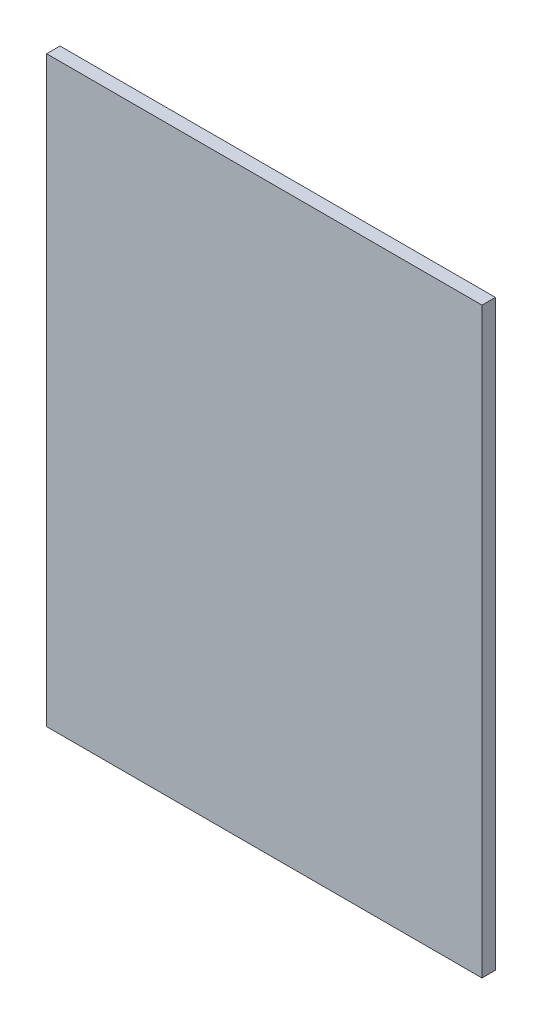
ISO-10303-21;
HEADER;
FILE_DESCRIPTION(('STEP AP214'),'2;1');
FILE_NAME('part.step','',(''),(''),'','','');
FILE_SCHEMA(('AUTOMOTIVE_DESIGN { 1 0 10303 214 1 1 1 1 }'));
ENDSEC;
DATA;
#1=APPLICATION_CONTEXT('core data for automotive mechanical design processes');
#2=APPLICATION_PROTOCOL_DEFINITION('international standard','automotive_design',2000,#1);
#3=PRODUCT_CONTEXT('',#1,'mechanical');
#4=PRODUCT('Part','Part','',(#3));
#5=PRODUCT_RELATED_PRODUCT_CATEGORY('part','',(#4));
#6=PRODUCT_DEFINITION_FORMATION('','',#4);
#7=PRODUCT_DEFINITION_CONTEXT('part definition',#1,'design');
#8=PRODUCT_DEFINITION('design','',#6,#7);
#9=PRODUCT_DEFINITION_SHAPE('','',#8);
#10=(LENGTH_UNIT() NAMED_UNIT(*) SI_UNIT(.MILLI.,.METRE.));
#11=(NAMED_UNIT(*) PLANE_ANGLE_UNIT() SI_UNIT($,.RADIAN.));
#12=(NAMED_UNIT(*) SI_UNIT($,.STERADIAN.) SOLID_ANGLE_UNIT());
#13=UNCERTAINTY_MEASURE_WITH_UNIT(LENGTH_MEASURE(1.E-05),#10,'distance_accuracy_value','');
#14=(GEOMETRIC_REPRESENTATION_CONTEXT(3) GLOBAL_UNCERTAINTY_ASSIGNED_CONTEXT((#13)) GLOBAL_UNIT_ASSIGNED_CONTEXT((#10,
#11,#12)) REPRESENTATION_CONTEXT('',''));
#15=CARTESIAN_POINT('',(0.,0.,0.));
#16=DIRECTION('',(0.,0.,1.));
#17=DIRECTION('',(1.,0.,0.));
#18=AXIS2_PLACEMENT_3D('',#15,#16,#17);
#19=CARTESIAN_POINT('',(32.5,43.5,2.));
#20=DIRECTION('',(-1.,0.,0.));
#21=DIRECTION('',(0.,-1.,0.));
#22=AXIS2_PLACEMENT_3D('',#19,#20,#21);
#23=PLANE('',#22);
#24=DIRECTION('',(0.,1.,0.));
#25=VECTOR('',#24,1.);
#26=CARTESIAN_POINT('',(32.5,43.5,0.));
#27=LINE('',#26,#25);
#28=CARTESIAN_POINT('',(32.5,-43.5,0.));
#29=VERTEX_POINT('',#28);
#30=CARTESIAN_POINT('',(32.5,43.5,0.));
#31=VERTEX_POINT('',#30);
#32=EDGE_CURVE('E113',#29,#31,#27,.T.);
#33=ORIENTED_EDGE('',*,*,#32,.T.);
#34=DIRECTION('',(0.,0.,-1.));
#35=VECTOR('',#34,1.);
#36=CARTESIAN_POINT('',(32.5,43.5,2.));
#37=LINE('',#36,#35);
#38=CARTESIAN_POINT('',(32.5,43.5,2.));
#39=VERTEX_POINT('',#38);
#40=EDGE_CURVE('E11',#39,#31,#37,.T.);
#41=ORIENTED_EDGE('',*,*,#40,.F.);
#42=DIRECTION('',(0.,1.,0.));
#43=VECTOR('',#42,1.);
#44=CARTESIAN_POINT('',(32.5,43.5,2.));
#45=LINE('',#44,#43);
#46=CARTESIAN_POINT('',(32.5,-43.5,2.));
#47=VERTEX_POINT('',#46);
#48=EDGE_CURVE('E97',#47,#39,#45,.T.);
#49=ORIENTED_EDGE('',*,*,#48,.F.);
#50=DIRECTION('',(0.,0.,-1.));
#51=VECTOR('',#50,1.);
#52=CARTESIAN_POINT('',(32.5,-43.5,2.));
#53=LINE('',#52,#51);
#54=EDGE_CURVE('E109',#47,#29,#53,.T.);
#55=ORIENTED_EDGE('',*,*,#54,.T.);
#56=EDGE_LOOP('',(#33,#41,#49,#55));
#57=FACE_BOUND('',#56,.T.);
#58=ADVANCED_FACE('F45',(#57),#23,.F.);
#59=CARTESIAN_POINT('',(-32.5,43.5,2.));
#60=DIRECTION('',(0.,-1.,0.));
#61=DIRECTION('',(0.,0.,-1.));
#62=AXIS2_PLACEMENT_3D('',#59,#60,#61);
#63=PLANE('',#62);
#64=DIRECTION('',(-1.,0.,0.));
#65=VECTOR('',#64,1.);
#66=CARTESIAN_POINT('',(-32.5,43.5,0.));
#67=LINE('',#66,#65);
#68=CARTESIAN_POINT('',(-32.5,43.5,0.));
#69=VERTEX_POINT('',#68);
#70=EDGE_CURVE('E102',#31,#69,#67,.T.);
#71=ORIENTED_EDGE('',*,*,#70,.T.);
#72=DIRECTION('',(0.,0.,-1.));
#73=VECTOR('',#72,1.);
#74=CARTESIAN_POINT('',(-32.5,43.5,2.));
#75=LINE('',#74,#73);
#76=CARTESIAN_POINT('',(-32.5,43.5,2.));
#77=VERTEX_POINT('',#76);
#78=EDGE_CURVE('E54',#77,#69,#75,.T.);
#79=ORIENTED_EDGE('',*,*,#78,.F.);
#80=DIRECTION('',(-1.,0.,0.));
#81=VECTOR('',#80,1.);
#82=CARTESIAN_POINT('',(-32.5,43.5,2.));
#83=LINE('',#82,#81);
#84=EDGE_CURVE('E92',#39,#77,#83,.T.);
#85=ORIENTED_EDGE('',*,*,#84,.F.);
#86=ORIENTED_EDGE('',*,*,#40,.T.);
#87=EDGE_LOOP('',(#71,#79,#85,#86));
#88=FACE_BOUND('',#87,.T.);
#89=ADVANCED_FACE('F101',(#88),#63,.F.);
#90=CARTESIAN_POINT('',(-32.5,43.5,2.));
#91=DIRECTION('',(1.,0.,0.));
#92=DIRECTION('',(0.,1.,0.));
#93=AXIS2_PLACEMENT_3D('',#90,#91,#92);
#94=PLANE('',#93);
#95=DIRECTION('',(0.,-1.,0.));
#96=VECTOR('',#95,1.);
#97=CARTESIAN_POINT('',(-32.5,43.5,0.));
#98=LINE('',#97,#96);
#99=CARTESIAN_POINT('',(-32.5,-43.5,0.));
#100=VERTEX_POINT('',#99);
#101=EDGE_CURVE('E79',#69,#100,#98,.T.);
#102=ORIENTED_EDGE('',*,*,#101,.T.);
#103=DIRECTION('',(0.,0.,-1.));
#104=VECTOR('',#103,1.);
#105=CARTESIAN_POINT('',(-32.5,-43.5,2.));
#106=LINE('',#105,#104);
#107=CARTESIAN_POINT('',(-32.5,-43.5,2.));
#108=VERTEX_POINT('',#107);
#109=EDGE_CURVE('E104',#108,#100,#106,.T.);
#110=ORIENTED_EDGE('',*,*,#109,.F.);
#111=DIRECTION('',(0.,-1.,0.));
#112=VECTOR('',#111,1.);
#113=CARTESIAN_POINT('',(-32.5,43.5,2.));
#114=LINE('',#113,#112);
#115=EDGE_CURVE('E95',#77,#108,#114,.T.);
#116=ORIENTED_EDGE('',*,*,#115,.F.);
#117=ORIENTED_EDGE('',*,*,#78,.T.);
#118=EDGE_LOOP('',(#102,#110,#116,#117));
#119=FACE_BOUND('',#118,.T.);
#120=ADVANCED_FACE('F105',(#119),#94,.F.);
#121=CARTESIAN_POINT('',(-32.5,-43.5,2.));
#122=DIRECTION('',(0.,1.,0.));
#123=DIRECTION('',(0.,0.,1.));
#124=AXIS2_PLACEMENT_3D('',#121,#122,#123);
#125=PLANE('',#124);
#126=DIRECTION('',(1.,0.,0.));
#127=VECTOR('',#126,1.);
#128=CARTESIAN_POINT('',(-32.5,-43.5,0.));
#129=LINE('',#128,#127);
#130=EDGE_CURVE('E85',#100,#29,#129,.T.);
#131=ORIENTED_EDGE('',*,*,#130,.T.);
#132=ORIENTED_EDGE('',*,*,#54,.F.);
#133=DIRECTION('',(1.,0.,0.));
#134=VECTOR('',#133,1.);
#135=CARTESIAN_POINT('',(-32.5,-43.5,2.));
#136=LINE('',#135,#134);
#137=EDGE_CURVE('E62',#108,#47,#136,.T.);
#138=ORIENTED_EDGE('',*,*,#137,.F.);
#139=ORIENTED_EDGE('',*,*,#109,.T.);
#140=EDGE_LOOP('',(#131,#132,#138,#139));
#141=FACE_BOUND('',#140,.T.);
#142=ADVANCED_FACE('F126',(#141),#125,.F.);
#143=CARTESIAN_POINT('',(0.,0.,2.));
#144=DIRECTION('',(0.,0.,1.));
#145=DIRECTION('',(1.,0.,0.));
#146=AXIS2_PLACEMENT_3D('',#143,#144,#145);
#147=PLANE('',#146);
#148=ORIENTED_EDGE('',*,*,#48,.T.);
#149=ORIENTED_EDGE('',*,*,#84,.T.);
#150=ORIENTED_EDGE('',*,*,#115,.T.);
#151=ORIENTED_EDGE('',*,*,#137,.T.);
#152=EDGE_LOOP('',(#148,#149,#150,#151));
#153=FACE_BOUND('',#152,.T.);
#154=ADVANCED_FACE('F93',(#153),#147,.T.);
#155=CARTESIAN_POINT('',(0.,0.,0.));
#156=DIRECTION('',(0.,0.,1.));
#157=DIRECTION('',(1.,0.,0.));
#158=AXIS2_PLACEMENT_3D('',#155,#156,#157);
#159=PLANE('',#158);
#160=ORIENTED_EDGE('',*,*,#32,.F.);
#161=ORIENTED_EDGE('',*,*,#130,.F.);
#162=ORIENTED_EDGE('',*,*,#101,.F.);
#163=ORIENTED_EDGE('',*,*,#70,.F.);
#164=EDGE_LOOP('',(#160,#161,#162,#163));
#165=FACE_BOUND('',#164,.T.);
#166=ADVANCED_FACE('F129',(#165),#159,.F.);
#167=CLOSED_SHELL('',(#58,#89,#120,#142,#154,#166));
#168=MANIFOLD_SOLID_BREP('B2',#167);
#169=ADVANCED_BREP_SHAPE_REPRESENTATION('',(#18,#168),#14);
#170=SHAPE_DEFINITION_REPRESENTATION(#9,#169);
ENDSEC;
END-ISO-10303-21;
